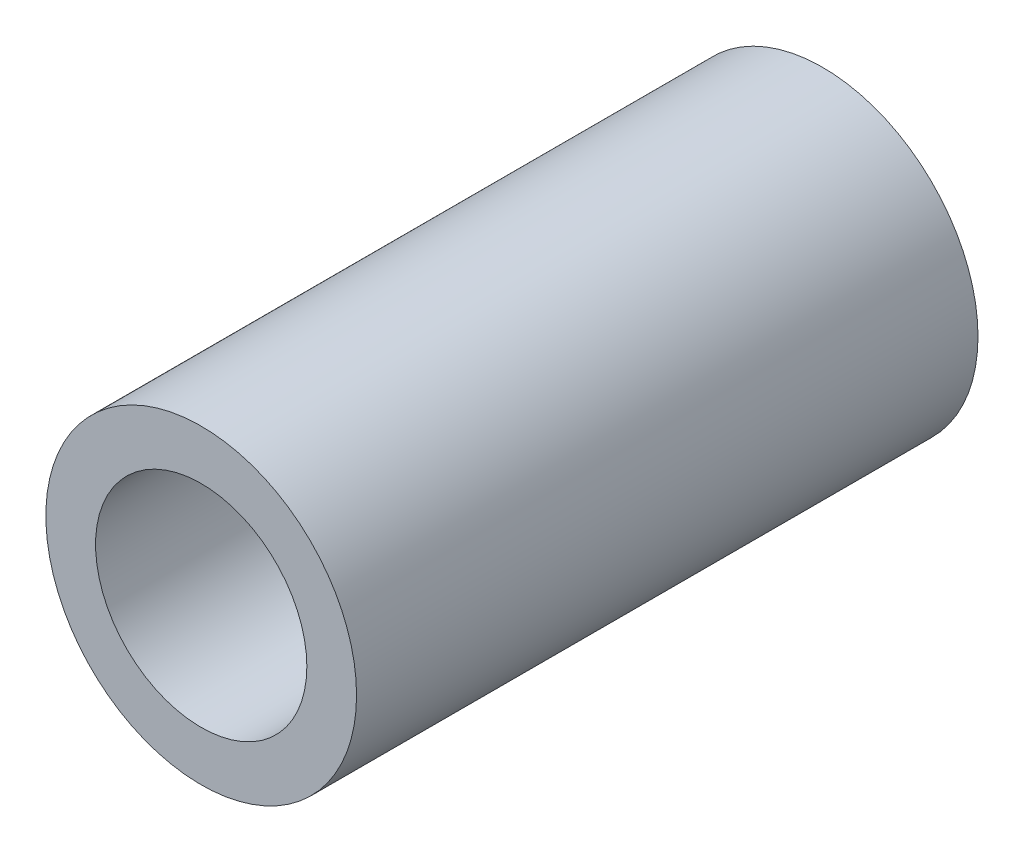
ISO-10303-21;
HEADER;
FILE_DESCRIPTION(('STEP AP214'),'2;1');
FILE_NAME('part.step','',(''),(''),'','','');
FILE_SCHEMA(('AUTOMOTIVE_DESIGN { 1 0 10303 214 1 1 1 1 }'));
ENDSEC;
DATA;
#1=APPLICATION_CONTEXT('core data for automotive mechanical design processes');
#2=APPLICATION_PROTOCOL_DEFINITION('international standard','automotive_design',2000,#1);
#3=PRODUCT_CONTEXT('',#1,'mechanical');
#4=PRODUCT('Part','Part','',(#3));
#5=PRODUCT_RELATED_PRODUCT_CATEGORY('part','',(#4));
#6=PRODUCT_DEFINITION_FORMATION('','',#4);
#7=PRODUCT_DEFINITION_CONTEXT('part definition',#1,'design');
#8=PRODUCT_DEFINITION('design','',#6,#7);
#9=PRODUCT_DEFINITION_SHAPE('','',#8);
#10=(LENGTH_UNIT() NAMED_UNIT(*) SI_UNIT(.MILLI.,.METRE.));
#11=(NAMED_UNIT(*) PLANE_ANGLE_UNIT() SI_UNIT($,.RADIAN.));
#12=(NAMED_UNIT(*) SI_UNIT($,.STERADIAN.) SOLID_ANGLE_UNIT());
#13=UNCERTAINTY_MEASURE_WITH_UNIT(LENGTH_MEASURE(1.E-05),#10,'distance_accuracy_value','');
#14=(GEOMETRIC_REPRESENTATION_CONTEXT(3) GLOBAL_UNCERTAINTY_ASSIGNED_CONTEXT((#13)) GLOBAL_UNIT_ASSIGNED_CONTEXT((#10,
#11,#12)) REPRESENTATION_CONTEXT('',''));
#15=CARTESIAN_POINT('',(0.,0.,0.));
#16=DIRECTION('',(0.,0.,1.));
#17=DIRECTION('',(1.,0.,0.));
#18=AXIS2_PLACEMENT_3D('',#15,#16,#17);
#19=CARTESIAN_POINT('',(0.,0.,10.));
#20=DIRECTION('',(0.,0.,-1.));
#21=DIRECTION('',(-1.,0.,0.));
#22=AXIS2_PLACEMENT_3D('',#19,#20,#21);
#23=CYLINDRICAL_SURFACE('',#22,2.5);
#24=CARTESIAN_POINT('',(0.,0.,10.));
#25=DIRECTION('',(0.,0.,1.));
#26=DIRECTION('',(1.,0.,0.));
#27=AXIS2_PLACEMENT_3D('',#24,#25,#26);
#28=CIRCLE('',#27,2.5);
#29=CARTESIAN_POINT('',(2.5,0.,10.));
#30=VERTEX_POINT('',#29);
#31=EDGE_CURVE('E10',#30,#30,#28,.T.);
#32=ORIENTED_EDGE('',*,*,#31,.F.);
#33=EDGE_LOOP('',(#32));
#34=FACE_BOUND('',#33,.T.);
#35=CARTESIAN_POINT('',(0.,0.,0.));
#36=DIRECTION('',(0.,0.,1.));
#37=DIRECTION('',(1.,0.,0.));
#38=AXIS2_PLACEMENT_3D('',#35,#36,#37);
#39=CIRCLE('',#38,2.5);
#40=CARTESIAN_POINT('',(2.5,0.,0.));
#41=VERTEX_POINT('',#40);
#42=EDGE_CURVE('E34',#41,#41,#39,.T.);
#43=ORIENTED_EDGE('',*,*,#42,.T.);
#44=EDGE_LOOP('',(#43));
#45=FACE_BOUND('',#44,.T.);
#46=ADVANCED_FACE('F31',(#34,#45),#23,.T.);
#47=CARTESIAN_POINT('',(0.,0.,10.));
#48=DIRECTION('',(0.,0.,1.));
#49=DIRECTION('',(1.,0.,0.));
#50=AXIS2_PLACEMENT_3D('',#47,#48,#49);
#51=PLANE('',#50);
#52=CARTESIAN_POINT('',(0.,0.,10.));
#53=DIRECTION('',(0.,0.,1.));
#54=DIRECTION('',(1.,0.,0.));
#55=AXIS2_PLACEMENT_3D('',#52,#53,#54);
#56=CIRCLE('',#55,1.69999999999999);
#57=CARTESIAN_POINT('',(1.69999999999999,0.,10.));
#58=VERTEX_POINT('',#57);
#59=EDGE_CURVE('E45',#58,#58,#56,.T.);
#60=ORIENTED_EDGE('',*,*,#59,.F.);
#61=EDGE_LOOP('',(#60));
#62=FACE_BOUND('',#61,.T.);
#63=ORIENTED_EDGE('',*,*,#31,.T.);
#64=EDGE_LOOP('',(#63));
#65=FACE_BOUND('',#64,.T.);
#66=ADVANCED_FACE('F51',(#62,#65),#51,.T.);
#67=CARTESIAN_POINT('',(0.,0.,0.));
#68=DIRECTION('',(0.,0.,1.));
#69=DIRECTION('',(1.,0.,0.));
#70=AXIS2_PLACEMENT_3D('',#67,#68,#69);
#71=PLANE('',#70);
#72=CARTESIAN_POINT('',(0.,0.,0.));
#73=DIRECTION('',(0.,0.,1.));
#74=DIRECTION('',(1.,0.,0.));
#75=AXIS2_PLACEMENT_3D('',#72,#73,#74);
#76=CIRCLE('',#75,1.69999999999999);
#77=CARTESIAN_POINT('',(1.69999999999999,0.,0.));
#78=VERTEX_POINT('',#77);
#79=EDGE_CURVE('E41',#78,#78,#76,.T.);
#80=ORIENTED_EDGE('',*,*,#79,.T.);
#81=EDGE_LOOP('',(#80));
#82=FACE_BOUND('',#81,.T.);
#83=ORIENTED_EDGE('',*,*,#42,.F.);
#84=EDGE_LOOP('',(#83));
#85=FACE_BOUND('',#84,.T.);
#86=ADVANCED_FACE('F53',(#82,#85),#71,.F.);
#87=CARTESIAN_POINT('',(0.,0.,10.));
#88=DIRECTION('',(0.,0.,1.));
#89=DIRECTION('',(1.,0.,0.));
#90=AXIS2_PLACEMENT_3D('',#87,#88,#89);
#91=CYLINDRICAL_SURFACE('',#90,1.69999999999999);
#92=ORIENTED_EDGE('',*,*,#79,.F.);
#93=EDGE_LOOP('',(#92));
#94=FACE_BOUND('',#93,.T.);
#95=ORIENTED_EDGE('',*,*,#59,.T.);
#96=EDGE_LOOP('',(#95));
#97=FACE_BOUND('',#96,.T.);
#98=ADVANCED_FACE('F49',(#94,#97),#91,.F.);
#99=CLOSED_SHELL('',(#46,#66,#86,#98));
#100=MANIFOLD_SOLID_BREP('B2',#99);
#101=ADVANCED_BREP_SHAPE_REPRESENTATION('',(#18,#100),#14);
#102=SHAPE_DEFINITION_REPRESENTATION(#9,#101);
ENDSEC;
END-ISO-10303-21;
